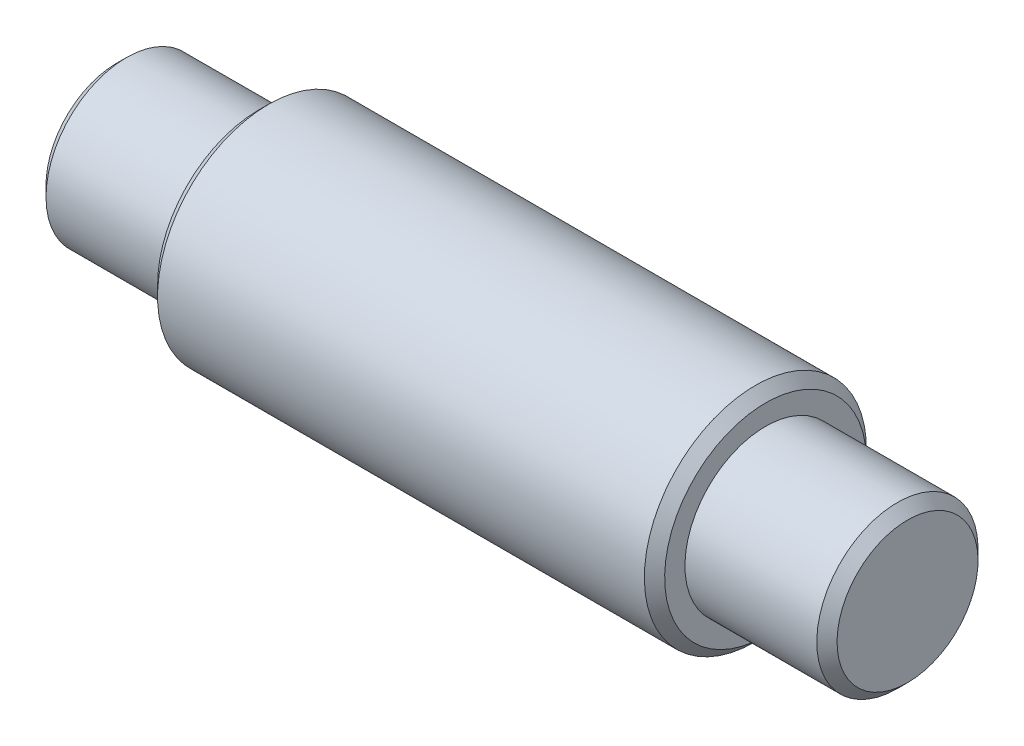
ISO-10303-21;
HEADER;
FILE_DESCRIPTION(('STEP AP214'),'2;1');
FILE_NAME('part.step','',(''),(''),'','','');
FILE_SCHEMA(('AUTOMOTIVE_DESIGN { 1 0 10303 214 1 1 1 1 }'));
ENDSEC;
DATA;
#1=APPLICATION_CONTEXT('core data for automotive mechanical design processes');
#2=APPLICATION_PROTOCOL_DEFINITION('international standard','automotive_design',2000,#1);
#3=PRODUCT_CONTEXT('',#1,'mechanical');
#4=PRODUCT('Part','Part','',(#3));
#5=PRODUCT_RELATED_PRODUCT_CATEGORY('part','',(#4));
#6=PRODUCT_DEFINITION_FORMATION('','',#4);
#7=PRODUCT_DEFINITION_CONTEXT('part definition',#1,'design');
#8=PRODUCT_DEFINITION('design','',#6,#7);
#9=PRODUCT_DEFINITION_SHAPE('','',#8);
#10=(LENGTH_UNIT() NAMED_UNIT(*) SI_UNIT(.MILLI.,.METRE.));
#11=(NAMED_UNIT(*) PLANE_ANGLE_UNIT() SI_UNIT($,.RADIAN.));
#12=(NAMED_UNIT(*) SI_UNIT($,.STERADIAN.) SOLID_ANGLE_UNIT());
#13=UNCERTAINTY_MEASURE_WITH_UNIT(LENGTH_MEASURE(1.E-05),#10,'distance_accuracy_value','');
#14=(GEOMETRIC_REPRESENTATION_CONTEXT(3) GLOBAL_UNCERTAINTY_ASSIGNED_CONTEXT((#13)) GLOBAL_UNIT_ASSIGNED_CONTEXT((#10,
#11,#12)) REPRESENTATION_CONTEXT('',''));
#15=CARTESIAN_POINT('',(0.,0.,0.));
#16=DIRECTION('',(0.,0.,1.));
#17=DIRECTION('',(1.,0.,0.));
#18=AXIS2_PLACEMENT_3D('',#15,#16,#17);
#19=CARTESIAN_POINT('',(-39.,0.,0.));
#20=DIRECTION('',(1.,0.,0.));
#21=DIRECTION('',(0.,1.00000000000001,0.));
#22=AXIS2_PLACEMENT_3D('',#19,#20,#21);
#23=PLANE('',#22);
#24=CARTESIAN_POINT('',(-39.,0.,0.));
#25=DIRECTION('',(1.,0.,0.));
#26=DIRECTION('',(0.,1.00000000000001,0.));
#27=AXIS2_PLACEMENT_3D('',#24,#25,#26);
#28=CIRCLE('',#27,6.95);
#29=CARTESIAN_POINT('',(-39.,6.95000000000007,0.));
#30=VERTEX_POINT('',#29);
#31=EDGE_CURVE('E50',#30,#30,#28,.F.);
#32=ORIENTED_EDGE('',*,*,#31,.T.);
#33=EDGE_LOOP('',(#32));
#34=FACE_BOUND('',#33,.T.);
#35=ADVANCED_FACE('F43',(#34),#23,.F.);
#36=CARTESIAN_POINT('',(-49.1163666121113,0.,0.));
#37=DIRECTION('',(-1.,0.,0.));
#38=DIRECTION('',(0.,-1.00000000000001,0.));
#39=AXIS2_PLACEMENT_3D('',#36,#37,#38);
#40=CYLINDRICAL_SURFACE('',#39,7.95);
#41=CARTESIAN_POINT('',(-38.,0.,0.));
#42=DIRECTION('',(1.,0.,0.));
#43=DIRECTION('',(0.,1.00000000000001,0.));
#44=AXIS2_PLACEMENT_3D('',#41,#42,#43);
#45=CIRCLE('',#44,7.95);
#46=CARTESIAN_POINT('',(-38.,7.95000000000007,0.));
#47=VERTEX_POINT('',#46);
#48=EDGE_CURVE('E12',#47,#47,#45,.T.);
#49=ORIENTED_EDGE('',*,*,#48,.T.);
#50=EDGE_LOOP('',(#49));
#51=FACE_BOUND('',#50,.T.);
#52=CARTESIAN_POINT('',(-25.,0.,0.));
#53=DIRECTION('',(-1.,0.,0.));
#54=DIRECTION('',(0.,-1.00000000000001,0.));
#55=AXIS2_PLACEMENT_3D('',#52,#53,#54);
#56=CIRCLE('',#55,7.94999999999999);
#57=CARTESIAN_POINT('',(-25.,-7.95000000000006,0.));
#58=VERTEX_POINT('',#57);
#59=EDGE_CURVE('E75',#58,#58,#56,.T.);
#60=ORIENTED_EDGE('',*,*,#59,.T.);
#61=EDGE_LOOP('',(#60));
#62=FACE_BOUND('',#61,.T.);
#63=ADVANCED_FACE('F100',(#51,#62),#40,.T.);
#64=CARTESIAN_POINT('',(-25.,7.95000000000001,0.));
#65=DIRECTION('',(1.,0.,0.));
#66=DIRECTION('',(0.,1.00000000000001,0.));
#67=AXIS2_PLACEMENT_3D('',#64,#65,#66);
#68=PLANE('',#67);
#69=CARTESIAN_POINT('',(-25.,0.,0.));
#70=DIRECTION('',(1.,0.,0.));
#71=DIRECTION('',(0.,1.00000000000001,0.));
#72=AXIS2_PLACEMENT_3D('',#69,#70,#71);
#73=CIRCLE('',#72,9.94999999999998);
#74=CARTESIAN_POINT('',(-25.,9.95000000000007,0.));
#75=VERTEX_POINT('',#74);
#76=EDGE_CURVE('E72',#75,#75,#73,.F.);
#77=ORIENTED_EDGE('',*,*,#76,.T.);
#78=EDGE_LOOP('',(#77));
#79=FACE_BOUND('',#78,.T.);
#80=ORIENTED_EDGE('',*,*,#59,.F.);
#81=EDGE_LOOP('',(#80));
#82=FACE_BOUND('',#81,.T.);
#83=ADVANCED_FACE('F105',(#79,#82),#68,.F.);
#84=CARTESIAN_POINT('',(-49.1163666121113,0.,0.));
#85=DIRECTION('',(-1.,0.,0.));
#86=DIRECTION('',(0.,-1.00000000000001,0.));
#87=AXIS2_PLACEMENT_3D('',#84,#85,#86);
#88=CYLINDRICAL_SURFACE('',#87,10.95);
#89=CARTESIAN_POINT('',(-24.,0.,0.));
#90=DIRECTION('',(1.,0.,0.));
#91=DIRECTION('',(0.,1.00000000000001,0.));
#92=AXIS2_PLACEMENT_3D('',#89,#90,#91);
#93=CIRCLE('',#92,10.95);
#94=CARTESIAN_POINT('',(-24.,10.9500000000001,0.));
#95=VERTEX_POINT('',#94);
#96=EDGE_CURVE('E66',#95,#95,#93,.T.);
#97=ORIENTED_EDGE('',*,*,#96,.T.);
#98=EDGE_LOOP('',(#97));
#99=FACE_BOUND('',#98,.T.);
#100=CARTESIAN_POINT('',(24.,0.,0.));
#101=DIRECTION('',(-1.,0.,0.));
#102=DIRECTION('',(0.,-1.00000000000001,0.));
#103=AXIS2_PLACEMENT_3D('',#100,#101,#102);
#104=CIRCLE('',#103,10.95);
#105=CARTESIAN_POINT('',(24.,-10.9500000000001,0.));
#106=VERTEX_POINT('',#105);
#107=EDGE_CURVE('E69',#106,#106,#104,.T.);
#108=ORIENTED_EDGE('',*,*,#107,.T.);
#109=EDGE_LOOP('',(#108));
#110=FACE_BOUND('',#109,.T.);
#111=ADVANCED_FACE('F96',(#99,#110),#88,.T.);
#112=CARTESIAN_POINT('',(24.9999999999998,10.95,0.));
#113=DIRECTION('',(-1.,0.,0.));
#114=DIRECTION('',(0.,-1.00000000000001,0.));
#115=AXIS2_PLACEMENT_3D('',#112,#113,#114);
#116=PLANE('',#115);
#117=CARTESIAN_POINT('',(25.,0.,0.));
#118=DIRECTION('',(-1.,0.,0.));
#119=DIRECTION('',(0.,-1.00000000000001,0.));
#120=AXIS2_PLACEMENT_3D('',#117,#118,#119);
#121=CIRCLE('',#120,9.94999999999999);
#122=CARTESIAN_POINT('',(25.,-9.95000000000007,0.));
#123=VERTEX_POINT('',#122);
#124=EDGE_CURVE('E63',#123,#123,#121,.F.);
#125=ORIENTED_EDGE('',*,*,#124,.T.);
#126=EDGE_LOOP('',(#125));
#127=FACE_BOUND('',#126,.T.);
#128=CARTESIAN_POINT('',(25.,0.,0.));
#129=DIRECTION('',(-1.,0.,0.));
#130=DIRECTION('',(0.,-1.00000000000001,0.));
#131=AXIS2_PLACEMENT_3D('',#128,#129,#130);
#132=CIRCLE('',#131,7.94999999999999);
#133=CARTESIAN_POINT('',(25.,-7.95000000000005,0.));
#134=VERTEX_POINT('',#133);
#135=EDGE_CURVE('E78',#134,#134,#132,.T.);
#136=ORIENTED_EDGE('',*,*,#135,.T.);
#137=EDGE_LOOP('',(#136));
#138=FACE_BOUND('',#137,.T.);
#139=ADVANCED_FACE('F82',(#127,#138),#116,.F.);
#140=CARTESIAN_POINT('',(-49.1163666121113,0.,0.));
#141=DIRECTION('',(-1.,0.,0.));
#142=DIRECTION('',(0.,-1.00000000000001,0.));
#143=AXIS2_PLACEMENT_3D('',#140,#141,#142);
#144=CYLINDRICAL_SURFACE('',#143,7.94999999999999);
#145=CARTESIAN_POINT('',(38.,0.,0.));
#146=DIRECTION('',(-1.,0.,0.));
#147=DIRECTION('',(0.,-1.00000000000001,0.));
#148=AXIS2_PLACEMENT_3D('',#145,#146,#147);
#149=CIRCLE('',#148,7.94999999999999);
#150=CARTESIAN_POINT('',(38.,-7.95000000000005,0.));
#151=VERTEX_POINT('',#150);
#152=EDGE_CURVE('E58',#151,#151,#149,.T.);
#153=ORIENTED_EDGE('',*,*,#152,.T.);
#154=EDGE_LOOP('',(#153));
#155=FACE_BOUND('',#154,.T.);
#156=ORIENTED_EDGE('',*,*,#135,.F.);
#157=EDGE_LOOP('',(#156));
#158=FACE_BOUND('',#157,.T.);
#159=ADVANCED_FACE('F84',(#155,#158),#144,.T.);
#160=CARTESIAN_POINT('',(39.,7.95000000000001,0.));
#161=DIRECTION('',(-1.,0.,0.));
#162=DIRECTION('',(0.,-1.00000000000001,0.));
#163=AXIS2_PLACEMENT_3D('',#160,#161,#162);
#164=PLANE('',#163);
#165=CARTESIAN_POINT('',(39.,0.,0.));
#166=DIRECTION('',(-1.,0.,0.));
#167=DIRECTION('',(0.,-1.00000000000001,0.));
#168=AXIS2_PLACEMENT_3D('',#165,#166,#167);
#169=CIRCLE('',#168,6.94999999999995);
#170=CARTESIAN_POINT('',(39.,-6.95000000000001,0.));
#171=VERTEX_POINT('',#170);
#172=EDGE_CURVE('E54',#171,#171,#169,.F.);
#173=ORIENTED_EDGE('',*,*,#172,.T.);
#174=EDGE_LOOP('',(#173));
#175=FACE_BOUND('',#174,.T.);
#176=ADVANCED_FACE('F86',(#175),#164,.F.);
#177=CARTESIAN_POINT('',(-25.,0.,0.));
#178=DIRECTION('',(1.,0.,0.));
#179=DIRECTION('',(0.,1.00000000000001,0.));
#180=AXIS2_PLACEMENT_3D('',#177,#178,#179);
#181=CONICAL_SURFACE('',#180,9.94999999999998,0.785398163397451);
#182=ORIENTED_EDGE('',*,*,#96,.F.);
#183=EDGE_LOOP('',(#182));
#184=FACE_BOUND('',#183,.T.);
#185=ORIENTED_EDGE('',*,*,#76,.F.);
#186=EDGE_LOOP('',(#185));
#187=FACE_BOUND('',#186,.T.);
#188=ADVANCED_FACE('F93',(#184,#187),#181,.T.);
#189=CARTESIAN_POINT('',(24.,0.,0.));
#190=DIRECTION('',(-1.,0.,0.));
#191=DIRECTION('',(0.,-1.00000000000001,0.));
#192=AXIS2_PLACEMENT_3D('',#189,#190,#191);
#193=CONICAL_SURFACE('',#192,10.95,0.785398163397449);
#194=ORIENTED_EDGE('',*,*,#124,.F.);
#195=EDGE_LOOP('',(#194));
#196=FACE_BOUND('',#195,.T.);
#197=ORIENTED_EDGE('',*,*,#107,.F.);
#198=EDGE_LOOP('',(#197));
#199=FACE_BOUND('',#198,.T.);
#200=ADVANCED_FACE('F111',(#196,#199),#193,.T.);
#201=CARTESIAN_POINT('',(38.,0.,0.));
#202=DIRECTION('',(-1.,0.,0.));
#203=DIRECTION('',(0.,-1.00000000000001,0.));
#204=AXIS2_PLACEMENT_3D('',#201,#202,#203);
#205=CONICAL_SURFACE('',#204,7.94999999999999,0.78539816339745);
#206=ORIENTED_EDGE('',*,*,#172,.F.);
#207=EDGE_LOOP('',(#206));
#208=FACE_BOUND('',#207,.T.);
#209=ORIENTED_EDGE('',*,*,#152,.F.);
#210=EDGE_LOOP('',(#209));
#211=FACE_BOUND('',#210,.T.);
#212=ADVANCED_FACE('F114',(#208,#211),#205,.T.);
#213=CARTESIAN_POINT('',(-39.,0.,0.));
#214=DIRECTION('',(1.,0.,0.));
#215=DIRECTION('',(0.,1.00000000000001,0.));
#216=AXIS2_PLACEMENT_3D('',#213,#214,#215);
#217=CONICAL_SURFACE('',#216,6.95,0.785398163397441);
#218=ORIENTED_EDGE('',*,*,#48,.F.);
#219=EDGE_LOOP('',(#218));
#220=FACE_BOUND('',#219,.T.);
#221=ORIENTED_EDGE('',*,*,#31,.F.);
#222=EDGE_LOOP('',(#221));
#223=FACE_BOUND('',#222,.T.);
#224=ADVANCED_FACE('F45',(#220,#223),#217,.T.);
#225=CLOSED_SHELL('',(#35,#63,#83,#111,#139,#159,#176,#188,#200,#212,#224));
#226=MANIFOLD_SOLID_BREP('B2',#225);
#227=ADVANCED_BREP_SHAPE_REPRESENTATION('',(#18,#226),#14);
#228=SHAPE_DEFINITION_REPRESENTATION(#9,#227);
ENDSEC;
END-ISO-10303-21;
